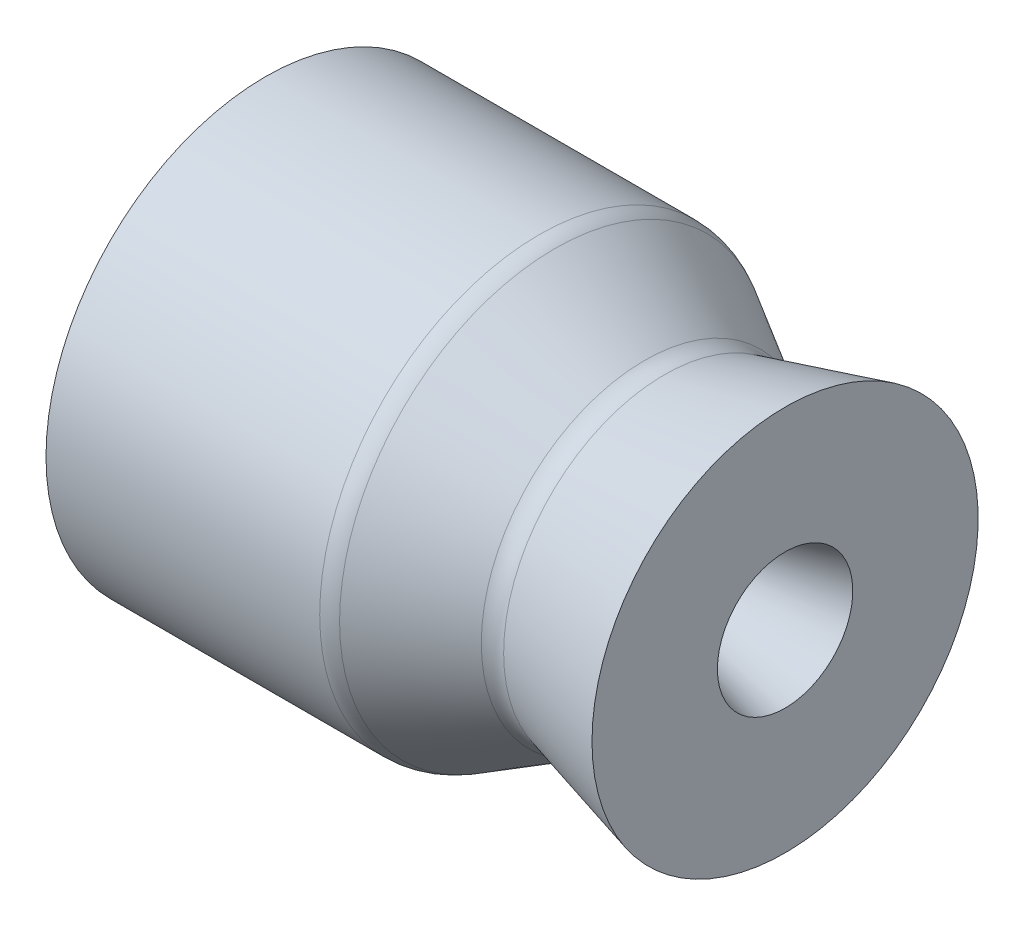
ISO-10303-21;
HEADER;
FILE_DESCRIPTION(('STEP AP214'),'2;1');
FILE_NAME('part.step','',(''),(''),'','','');
FILE_SCHEMA(('AUTOMOTIVE_DESIGN { 1 0 10303 214 1 1 1 1 }'));
ENDSEC;
DATA;
#1=APPLICATION_CONTEXT('core data for automotive mechanical design processes');
#2=APPLICATION_PROTOCOL_DEFINITION('international standard','automotive_design',2000,#1);
#3=PRODUCT_CONTEXT('',#1,'mechanical');
#4=PRODUCT('Part','Part','',(#3));
#5=PRODUCT_RELATED_PRODUCT_CATEGORY('part','',(#4));
#6=PRODUCT_DEFINITION_FORMATION('','',#4);
#7=PRODUCT_DEFINITION_CONTEXT('part definition',#1,'design');
#8=PRODUCT_DEFINITION('design','',#6,#7);
#9=PRODUCT_DEFINITION_SHAPE('','',#8);
#10=(LENGTH_UNIT() NAMED_UNIT(*) SI_UNIT(.MILLI.,.METRE.));
#11=(NAMED_UNIT(*) PLANE_ANGLE_UNIT() SI_UNIT($,.RADIAN.));
#12=(NAMED_UNIT(*) SI_UNIT($,.STERADIAN.) SOLID_ANGLE_UNIT());
#13=UNCERTAINTY_MEASURE_WITH_UNIT(LENGTH_MEASURE(1.E-05),#10,'distance_accuracy_value','');
#14=(GEOMETRIC_REPRESENTATION_CONTEXT(3) GLOBAL_UNCERTAINTY_ASSIGNED_CONTEXT((#13)) GLOBAL_UNIT_ASSIGNED_CONTEXT((#10,
#11,#12)) REPRESENTATION_CONTEXT('',''));
#15=CARTESIAN_POINT('',(0.,0.,0.));
#16=DIRECTION('',(0.,0.,1.));
#17=DIRECTION('',(1.,0.,0.));
#18=AXIS2_PLACEMENT_3D('',#15,#16,#17);
#19=CARTESIAN_POINT('',(0.,55.88,0.));
#20=DIRECTION('',(1.,0.,0.));
#21=DIRECTION('',(0.,0.,-1.));
#22=AXIS2_PLACEMENT_3D('',#19,#20,#21);
#23=PLANE('',#22);
#24=CARTESIAN_POINT('',(0.,62.6915789799551,-36.1950000000007));
#25=DIRECTION('',(-1.,0.,0.));
#26=DIRECTION('',(0.,0.,1.));
#27=AXIS2_PLACEMENT_3D('',#24,#25,#26);
#28=CIRCLE('',#27,6.985);
#29=CARTESIAN_POINT('',(0.,62.6915789799551,-29.2100000000007));
#30=VERTEX_POINT('',#29);
#31=EDGE_CURVE('E87',#30,#30,#28,.T.);
#32=ORIENTED_EDGE('',*,*,#31,.F.);
#33=EDGE_LOOP('',(#32));
#34=FACE_BOUND('',#33,.T.);
#35=CARTESIAN_POINT('',(0.,0.,72.39));
#36=DIRECTION('',(-1.,0.,0.));
#37=DIRECTION('',(0.,0.,1.));
#38=AXIS2_PLACEMENT_3D('',#35,#36,#37);
#39=CIRCLE('',#38,6.985);
#40=CARTESIAN_POINT('',(0.,0.,79.375));
#41=VERTEX_POINT('',#40);
#42=EDGE_CURVE('E98',#41,#41,#39,.T.);
#43=ORIENTED_EDGE('',*,*,#42,.F.);
#44=EDGE_LOOP('',(#43));
#45=FACE_BOUND('',#44,.T.);
#46=CARTESIAN_POINT('',(0.,-62.6915789799554,36.1950000000003));
#47=DIRECTION('',(-1.,0.,0.));
#48=DIRECTION('',(0.,0.,1.));
#49=AXIS2_PLACEMENT_3D('',#46,#47,#48);
#50=CIRCLE('',#49,6.985);
#51=CARTESIAN_POINT('',(0.,-62.6915789799554,43.1800000000003));
#52=VERTEX_POINT('',#51);
#53=EDGE_CURVE('E110',#52,#52,#50,.T.);
#54=ORIENTED_EDGE('',*,*,#53,.F.);
#55=EDGE_LOOP('',(#54));
#56=FACE_BOUND('',#55,.T.);
#57=CARTESIAN_POINT('',(0.,-62.6915789799556,-36.1949999999999));
#58=DIRECTION('',(-1.,0.,0.));
#59=DIRECTION('',(0.,0.,1.));
#60=AXIS2_PLACEMENT_3D('',#57,#58,#59);
#61=CIRCLE('',#60,6.985);
#62=CARTESIAN_POINT('',(0.,-62.6915789799556,-29.2099999999999));
#63=VERTEX_POINT('',#62);
#64=EDGE_CURVE('E122',#63,#63,#61,.T.);
#65=ORIENTED_EDGE('',*,*,#64,.F.);
#66=EDGE_LOOP('',(#65));
#67=FACE_BOUND('',#66,.T.);
#68=CARTESIAN_POINT('',(0.,0.,-72.39));
#69=DIRECTION('',(-1.,0.,0.));
#70=DIRECTION('',(0.,0.,1.));
#71=AXIS2_PLACEMENT_3D('',#68,#69,#70);
#72=CIRCLE('',#71,6.985);
#73=CARTESIAN_POINT('',(0.,0.,-65.405));
#74=VERTEX_POINT('',#73);
#75=EDGE_CURVE('E134',#74,#74,#72,.T.);
#76=ORIENTED_EDGE('',*,*,#75,.F.);
#77=EDGE_LOOP('',(#76));
#78=FACE_BOUND('',#77,.T.);
#79=CARTESIAN_POINT('',(0.,0.,0.));
#80=DIRECTION('',(-1.,0.,0.));
#81=DIRECTION('',(0.,0.,1.));
#82=AXIS2_PLACEMENT_3D('',#79,#80,#81);
#83=CIRCLE('',#82,55.88);
#84=CARTESIAN_POINT('',(0.,0.,55.88));
#85=VERTEX_POINT('',#84);
#86=EDGE_CURVE('E186',#85,#85,#83,.T.);
#87=ORIENTED_EDGE('',*,*,#86,.F.);
#88=EDGE_LOOP('',(#87));
#89=FACE_BOUND('',#88,.T.);
#90=CARTESIAN_POINT('',(0.,0.,0.));
#91=DIRECTION('',(-1.,0.,0.));
#92=DIRECTION('',(0.,0.,1.));
#93=AXIS2_PLACEMENT_3D('',#90,#91,#92);
#94=CIRCLE('',#93,88.9);
#95=CARTESIAN_POINT('',(0.,0.,88.9));
#96=VERTEX_POINT('',#95);
#97=EDGE_CURVE('E182',#96,#96,#94,.T.);
#98=ORIENTED_EDGE('',*,*,#97,.T.);
#99=EDGE_LOOP('',(#98));
#100=FACE_BOUND('',#99,.T.);
#101=CARTESIAN_POINT('',(0.,62.6915789799558,36.1949999999994));
#102=DIRECTION('',(-1.,0.,0.));
#103=DIRECTION('',(0.,0.,1.));
#104=AXIS2_PLACEMENT_3D('',#101,#102,#103);
#105=CIRCLE('',#104,6.985);
#106=CARTESIAN_POINT('',(0.,62.6915789799558,43.1799999999994));
#107=VERTEX_POINT('',#106);
#108=EDGE_CURVE('E78',#107,#107,#105,.T.);
#109=ORIENTED_EDGE('',*,*,#108,.F.);
#110=EDGE_LOOP('',(#109));
#111=FACE_BOUND('',#110,.T.);
#112=ADVANCED_FACE('F39',(#34,#45,#56,#67,#78,#89,#100,#111),#23,.F.);
#113=CARTESIAN_POINT('',(110.897045256125,0.,0.));
#114=DIRECTION('',(-1.,0.,0.));
#115=DIRECTION('',(0.,0.,1.));
#116=AXIS2_PLACEMENT_3D('',#113,#114,#115);
#117=TOROIDAL_SURFACE('',#116,25.4,12.7);
#118=CARTESIAN_POINT('',(117.247045256125,0.,0.));
#119=DIRECTION('',(-1.,0.,0.));
#120=DIRECTION('',(0.,0.,1.));
#121=AXIS2_PLACEMENT_3D('',#118,#119,#120);
#122=CIRCLE('',#121,36.3985226280624);
#123=CARTESIAN_POINT('',(117.247045256125,0.,36.3985226280624));
#124=VERTEX_POINT('',#123);
#125=EDGE_CURVE('E146',#124,#124,#122,.T.);
#126=ORIENTED_EDGE('',*,*,#125,.F.);
#127=EDGE_LOOP('',(#126));
#128=FACE_BOUND('',#127,.T.);
#129=CARTESIAN_POINT('',(110.897045256125,0.,0.));
#130=DIRECTION('',(-1.,0.,0.));
#131=DIRECTION('',(0.,0.,1.));
#132=AXIS2_PLACEMENT_3D('',#129,#130,#131);
#133=CIRCLE('',#132,38.1);
#134=CARTESIAN_POINT('',(110.897045256125,0.,38.1));
#135=VERTEX_POINT('',#134);
#136=EDGE_CURVE('E11',#135,#135,#133,.T.);
#137=ORIENTED_EDGE('',*,*,#136,.T.);
#138=EDGE_LOOP('',(#137));
#139=FACE_BOUND('',#138,.T.);
#140=ADVANCED_FACE('F41',(#128,#139),#117,.F.);
#141=CARTESIAN_POINT('',(0.,0.,0.));
#142=DIRECTION('',(-1.,0.,0.));
#143=DIRECTION('',(0.,0.,1.));
#144=AXIS2_PLACEMENT_3D('',#141,#142,#143);
#145=CYLINDRICAL_SURFACE('',#144,38.1);
#146=ORIENTED_EDGE('',*,*,#136,.F.);
#147=EDGE_LOOP('',(#146));
#148=FACE_BOUND('',#147,.T.);
#149=CARTESIAN_POINT('',(0.,0.,0.));
#150=DIRECTION('',(-1.,0.,0.));
#151=DIRECTION('',(0.,0.,1.));
#152=AXIS2_PLACEMENT_3D('',#149,#150,#151);
#153=CIRCLE('',#152,38.1);
#154=CARTESIAN_POINT('',(0.,0.,38.1));
#155=VERTEX_POINT('',#154);
#156=EDGE_CURVE('E48',#155,#155,#153,.T.);
#157=ORIENTED_EDGE('',*,*,#156,.T.);
#158=EDGE_LOOP('',(#157));
#159=FACE_BOUND('',#158,.T.);
#160=ADVANCED_FACE('F205',(#148,#159),#145,.F.);
#161=CARTESIAN_POINT('',(0.,38.1,0.));
#162=DIRECTION('',(1.,0.,0.));
#163=DIRECTION('',(0.,0.,-1.));
#164=AXIS2_PLACEMENT_3D('',#161,#162,#163);
#165=PLANE('',#164);
#166=ORIENTED_EDGE('',*,*,#156,.F.);
#167=EDGE_LOOP('',(#166));
#168=FACE_BOUND('',#167,.T.);
#169=CARTESIAN_POINT('',(0.,0.,0.));
#170=DIRECTION('',(-1.,0.,0.));
#171=DIRECTION('',(0.,0.,1.));
#172=AXIS2_PLACEMENT_3D('',#169,#170,#171);
#173=CIRCLE('',#172,45.72);
#174=CARTESIAN_POINT('',(0.,0.,45.72));
#175=VERTEX_POINT('',#174);
#176=EDGE_CURVE('E198',#175,#175,#173,.T.);
#177=ORIENTED_EDGE('',*,*,#176,.T.);
#178=EDGE_LOOP('',(#177));
#179=FACE_BOUND('',#178,.T.);
#180=ADVANCED_FACE('F207',(#168,#179),#165,.F.);
#181=CARTESIAN_POINT('',(0.,0.,0.));
#182=DIRECTION('',(-1.,0.,0.));
#183=DIRECTION('',(0.,0.,1.));
#184=AXIS2_PLACEMENT_3D('',#181,#182,#183);
#185=CYLINDRICAL_SURFACE('',#184,45.72);
#186=ORIENTED_EDGE('',*,*,#176,.F.);
#187=EDGE_LOOP('',(#186));
#188=FACE_BOUND('',#187,.T.);
#189=CARTESIAN_POINT('',(5.08,0.,0.));
#190=DIRECTION('',(-1.,0.,0.));
#191=DIRECTION('',(0.,0.,1.));
#192=AXIS2_PLACEMENT_3D('',#189,#190,#191);
#193=CIRCLE('',#192,45.72);
#194=CARTESIAN_POINT('',(5.08,0.,45.72));
#195=VERTEX_POINT('',#194);
#196=EDGE_CURVE('E194',#195,#195,#193,.T.);
#197=ORIENTED_EDGE('',*,*,#196,.T.);
#198=EDGE_LOOP('',(#197));
#199=FACE_BOUND('',#198,.T.);
#200=ADVANCED_FACE('F210',(#188,#199),#185,.T.);
#201=CARTESIAN_POINT('',(5.08,45.72,0.));
#202=DIRECTION('',(1.,0.,0.));
#203=DIRECTION('',(0.,0.,-1.));
#204=AXIS2_PLACEMENT_3D('',#201,#202,#203);
#205=PLANE('',#204);
#206=ORIENTED_EDGE('',*,*,#196,.F.);
#207=EDGE_LOOP('',(#206));
#208=FACE_BOUND('',#207,.T.);
#209=CARTESIAN_POINT('',(5.08,0.,0.));
#210=DIRECTION('',(-1.,0.,0.));
#211=DIRECTION('',(0.,0.,1.));
#212=AXIS2_PLACEMENT_3D('',#209,#210,#211);
#213=CIRCLE('',#212,55.88);
#214=CARTESIAN_POINT('',(5.08,0.,55.88));
#215=VERTEX_POINT('',#214);
#216=EDGE_CURVE('E190',#215,#215,#213,.T.);
#217=ORIENTED_EDGE('',*,*,#216,.T.);
#218=EDGE_LOOP('',(#217));
#219=FACE_BOUND('',#218,.T.);
#220=ADVANCED_FACE('F216',(#208,#219),#205,.F.);
#221=CARTESIAN_POINT('',(0.,0.,0.));
#222=DIRECTION('',(-1.,0.,0.));
#223=DIRECTION('',(0.,0.,1.));
#224=AXIS2_PLACEMENT_3D('',#221,#222,#223);
#225=CYLINDRICAL_SURFACE('',#224,55.88);
#226=ORIENTED_EDGE('',*,*,#216,.F.);
#227=EDGE_LOOP('',(#226));
#228=FACE_BOUND('',#227,.T.);
#229=ORIENTED_EDGE('',*,*,#86,.T.);
#230=EDGE_LOOP('',(#229));
#231=FACE_BOUND('',#230,.T.);
#232=ADVANCED_FACE('F222',(#228,#231),#225,.F.);
#233=CARTESIAN_POINT('',(0.,0.,0.));
#234=DIRECTION('',(-1.,0.,0.));
#235=DIRECTION('',(0.,0.,1.));
#236=AXIS2_PLACEMENT_3D('',#233,#234,#235);
#237=CYLINDRICAL_SURFACE('',#236,88.9);
#238=ORIENTED_EDGE('',*,*,#97,.F.);
#239=EDGE_LOOP('',(#238));
#240=FACE_BOUND('',#239,.T.);
#241=CARTESIAN_POINT('',(110.897045256125,0.,0.));
#242=DIRECTION('',(-1.,0.,0.));
#243=DIRECTION('',(0.,0.,1.));
#244=AXIS2_PLACEMENT_3D('',#241,#242,#243);
#245=CIRCLE('',#244,88.9);
#246=CARTESIAN_POINT('',(110.897045256125,0.,88.9));
#247=VERTEX_POINT('',#246);
#248=EDGE_CURVE('E178',#247,#247,#245,.T.);
#249=ORIENTED_EDGE('',*,*,#248,.T.);
#250=EDGE_LOOP('',(#249));
#251=FACE_BOUND('',#250,.T.);
#252=ADVANCED_FACE('F228',(#240,#251),#237,.T.);
#253=CARTESIAN_POINT('',(110.897045256125,0.,0.));
#254=DIRECTION('',(-1.,0.,0.));
#255=DIRECTION('',(0.,0.,1.));
#256=AXIS2_PLACEMENT_3D('',#253,#254,#255);
#257=TOROIDAL_SURFACE('',#256,76.2,12.7);
#258=ORIENTED_EDGE('',*,*,#248,.F.);
#259=EDGE_LOOP('',(#258));
#260=FACE_BOUND('',#259,.T.);
#261=CARTESIAN_POINT('',(117.247045256125,0.,0.));
#262=DIRECTION('',(-1.,0.,0.));
#263=DIRECTION('',(0.,0.,1.));
#264=AXIS2_PLACEMENT_3D('',#261,#262,#263);
#265=CIRCLE('',#264,87.1985226280624);
#266=CARTESIAN_POINT('',(117.247045256125,0.,87.1985226280624));
#267=VERTEX_POINT('',#266);
#268=EDGE_CURVE('E174',#267,#267,#265,.T.);
#269=ORIENTED_EDGE('',*,*,#268,.T.);
#270=EDGE_LOOP('',(#269));
#271=FACE_BOUND('',#270,.T.);
#272=ADVANCED_FACE('F329',(#260,#271),#257,.T.);
#273=CARTESIAN_POINT('',(153.648338424054,0.,0.));
#274=DIRECTION('',(-1.,0.,0.));
#275=DIRECTION('',(0.,0.,1.));
#276=AXIS2_PLACEMENT_3D('',#273,#274,#275);
#277=CONICAL_SURFACE('',#276,66.1822262187082,0.523598775598291);
#278=ORIENTED_EDGE('',*,*,#268,.F.);
#279=EDGE_LOOP('',(#278));
#280=FACE_BOUND('',#279,.T.);
#281=CARTESIAN_POINT('',(153.648338424054,0.,0.));
#282=DIRECTION('',(-1.,0.,0.));
#283=DIRECTION('',(0.,0.,1.));
#284=AXIS2_PLACEMENT_3D('',#281,#282,#283);
#285=CIRCLE('',#284,66.1822262187082);
#286=CARTESIAN_POINT('',(153.648338424054,0.,66.1822262187082));
#287=VERTEX_POINT('',#286);
#288=EDGE_CURVE('E170',#287,#287,#285,.T.);
#289=ORIENTED_EDGE('',*,*,#288,.T.);
#290=EDGE_LOOP('',(#289));
#291=FACE_BOUND('',#290,.T.);
#292=ADVANCED_FACE('F325',(#280,#291),#277,.T.);
#293=CARTESIAN_POINT('',(158.918838424054,0.,0.));
#294=DIRECTION('',(-1.,0.,0.));
#295=DIRECTION('',(0.,0.,1.));
#296=AXIS2_PLACEMENT_3D('',#293,#294,#295);
#297=TOROIDAL_SURFACE('',#296,75.311,10.541);
#298=ORIENTED_EDGE('',*,*,#288,.F.);
#299=EDGE_LOOP('',(#298));
#300=FACE_BOUND('',#299,.T.);
#301=CARTESIAN_POINT('',(161.64704997848,0.,0.));
#302=DIRECTION('',(-1.,0.,0.));
#303=DIRECTION('',(0.,0.,1.));
#304=AXIS2_PLACEMENT_3D('',#301,#302,#303);
#305=CIRCLE('',#304,65.1291758650869);
#306=CARTESIAN_POINT('',(161.64704997848,0.,65.1291758650869));
#307=VERTEX_POINT('',#306);
#308=EDGE_CURVE('E166',#307,#307,#305,.T.);
#309=ORIENTED_EDGE('',*,*,#308,.T.);
#310=EDGE_LOOP('',(#309));
#311=FACE_BOUND('',#310,.T.);
#312=ADVANCED_FACE('F321',(#300,#311),#297,.F.);
#313=CARTESIAN_POINT('',(210.545228126124,0.,0.));
#314=DIRECTION('',(1.,0.,0.));
#315=DIRECTION('',(0.,0.,-1.));
#316=AXIS2_PLACEMENT_3D('',#313,#314,#315);
#317=CONICAL_SURFACE('',#316,78.231403211101,0.261799387799143);
#318=ORIENTED_EDGE('',*,*,#308,.F.);
#319=EDGE_LOOP('',(#318));
#320=FACE_BOUND('',#319,.T.);
#321=CARTESIAN_POINT('',(210.545228126124,0.,0.));
#322=DIRECTION('',(-1.,0.,0.));
#323=DIRECTION('',(0.,0.,1.));
#324=AXIS2_PLACEMENT_3D('',#321,#322,#323);
#325=CIRCLE('',#324,78.231403211101);
#326=CARTESIAN_POINT('',(210.545228126124,0.,78.231403211101));
#327=VERTEX_POINT('',#326);
#328=EDGE_CURVE('E162',#327,#327,#325,.T.);
#329=ORIENTED_EDGE('',*,*,#328,.T.);
#330=EDGE_LOOP('',(#329));
#331=FACE_BOUND('',#330,.T.);
#332=ADVANCED_FACE('F317',(#320,#331),#317,.T.);
#333=CARTESIAN_POINT('',(210.545228126124,78.231403211101,0.));
#334=DIRECTION('',(-1.,0.,0.));
#335=DIRECTION('',(0.,0.,1.));
#336=AXIS2_PLACEMENT_3D('',#333,#334,#335);
#337=PLANE('',#336);
#338=ORIENTED_EDGE('',*,*,#328,.F.);
#339=EDGE_LOOP('',(#338));
#340=FACE_BOUND('',#339,.T.);
#341=CARTESIAN_POINT('',(210.545228126124,0.,0.));
#342=DIRECTION('',(-1.,0.,0.));
#343=DIRECTION('',(0.,0.,1.));
#344=AXIS2_PLACEMENT_3D('',#341,#342,#343);
#345=CIRCLE('',#344,27.431403211101);
#346=CARTESIAN_POINT('',(210.545228126124,0.,27.431403211101));
#347=VERTEX_POINT('',#346);
#348=EDGE_CURVE('E158',#347,#347,#345,.T.);
#349=ORIENTED_EDGE('',*,*,#348,.T.);
#350=EDGE_LOOP('',(#349));
#351=FACE_BOUND('',#350,.T.);
#352=ADVANCED_FACE('F313',(#340,#351),#337,.F.);
#353=CARTESIAN_POINT('',(161.64704997848,0.,0.));
#354=DIRECTION('',(1.,0.,0.));
#355=DIRECTION('',(0.,0.,-1.));
#356=AXIS2_PLACEMENT_3D('',#353,#354,#355);
#357=CONICAL_SURFACE('',#356,14.3291758650869,0.261799387799143);
#358=ORIENTED_EDGE('',*,*,#348,.F.);
#359=EDGE_LOOP('',(#358));
#360=FACE_BOUND('',#359,.T.);
#361=CARTESIAN_POINT('',(161.64704997848,0.,0.));
#362=DIRECTION('',(-1.,0.,0.));
#363=DIRECTION('',(0.,0.,1.));
#364=AXIS2_PLACEMENT_3D('',#361,#362,#363);
#365=CIRCLE('',#364,14.3291758650869);
#366=CARTESIAN_POINT('',(161.64704997848,0.,14.3291758650869));
#367=VERTEX_POINT('',#366);
#368=EDGE_CURVE('E154',#367,#367,#365,.T.);
#369=ORIENTED_EDGE('',*,*,#368,.T.);
#370=EDGE_LOOP('',(#369));
#371=FACE_BOUND('',#370,.T.);
#372=ADVANCED_FACE('F309',(#360,#371),#357,.F.);
#373=CARTESIAN_POINT('',(158.918838424054,0.,0.));
#374=DIRECTION('',(-1.,0.,0.));
#375=DIRECTION('',(0.,0.,1.));
#376=AXIS2_PLACEMENT_3D('',#373,#374,#375);
#377=TOROIDAL_SURFACE('',#376,24.511,10.541);
#378=ORIENTED_EDGE('',*,*,#368,.F.);
#379=EDGE_LOOP('',(#378));
#380=FACE_BOUND('',#379,.T.);
#381=CARTESIAN_POINT('',(153.648338424054,0.,0.));
#382=DIRECTION('',(-1.,0.,0.));
#383=DIRECTION('',(0.,0.,1.));
#384=AXIS2_PLACEMENT_3D('',#381,#382,#383);
#385=CIRCLE('',#384,15.3822262187082);
#386=CARTESIAN_POINT('',(153.648338424054,0.,15.3822262187082));
#387=VERTEX_POINT('',#386);
#388=EDGE_CURVE('E150',#387,#387,#385,.T.);
#389=ORIENTED_EDGE('',*,*,#388,.T.);
#390=EDGE_LOOP('',(#389));
#391=FACE_BOUND('',#390,.T.);
#392=ADVANCED_FACE('F305',(#380,#391),#377,.T.);
#393=CARTESIAN_POINT('',(117.247045256125,0.,0.));
#394=DIRECTION('',(-1.,0.,0.));
#395=DIRECTION('',(0.,0.,1.));
#396=AXIS2_PLACEMENT_3D('',#393,#394,#395);
#397=CONICAL_SURFACE('',#396,36.3985226280624,0.523598775598291);
#398=ORIENTED_EDGE('',*,*,#388,.F.);
#399=EDGE_LOOP('',(#398));
#400=FACE_BOUND('',#399,.T.);
#401=ORIENTED_EDGE('',*,*,#125,.T.);
#402=EDGE_LOOP('',(#401));
#403=FACE_BOUND('',#402,.T.);
#404=ADVANCED_FACE('F302',(#400,#403),#397,.F.);
#405=CARTESIAN_POINT('',(12.7,0.,-72.39));
#406=DIRECTION('',(-1.,0.,0.));
#407=DIRECTION('',(0.,0.,1.));
#408=AXIS2_PLACEMENT_3D('',#405,#406,#407);
#409=CONICAL_SURFACE('',#408,6.35,1.02974425867665);
#410=CARTESIAN_POINT('',(16.515464930825,0.,-72.39));
#411=VERTEX_POINT('',#410);
#412=VERTEX_LOOP('',#411);
#413=FACE_BOUND('',#412,.T.);
#414=CARTESIAN_POINT('',(12.7,0.,-72.39));
#415=DIRECTION('',(-1.,0.,0.));
#416=DIRECTION('',(0.,0.,1.));
#417=AXIS2_PLACEMENT_3D('',#414,#415,#416);
#418=CIRCLE('',#417,6.35);
#419=CARTESIAN_POINT('',(12.7,0.,-66.04));
#420=VERTEX_POINT('',#419);
#421=EDGE_CURVE('E142',#420,#420,#418,.T.);
#422=ORIENTED_EDGE('',*,*,#421,.T.);
#423=EDGE_LOOP('',(#422));
#424=FACE_BOUND('',#423,.T.);
#425=ADVANCED_FACE('F298',(#413,#424),#409,.F.);
#426=CARTESIAN_POINT('',(0.,0.,-72.39));
#427=DIRECTION('',(-1.,0.,0.));
#428=DIRECTION('',(0.,0.,1.));
#429=AXIS2_PLACEMENT_3D('',#426,#427,#428);
#430=CYLINDRICAL_SURFACE('',#429,6.35);
#431=ORIENTED_EDGE('',*,*,#421,.F.);
#432=EDGE_LOOP('',(#431));
#433=FACE_BOUND('',#432,.T.);
#434=CARTESIAN_POINT('',(0.635000000000002,0.,-72.39));
#435=DIRECTION('',(-1.,0.,0.));
#436=DIRECTION('',(0.,0.,1.));
#437=AXIS2_PLACEMENT_3D('',#434,#435,#436);
#438=CIRCLE('',#437,6.35);
#439=CARTESIAN_POINT('',(0.635000000000002,0.,-66.04));
#440=VERTEX_POINT('',#439);
#441=EDGE_CURVE('E138',#440,#440,#438,.T.);
#442=ORIENTED_EDGE('',*,*,#441,.T.);
#443=EDGE_LOOP('',(#442));
#444=FACE_BOUND('',#443,.T.);
#445=ADVANCED_FACE('F294',(#433,#444),#430,.F.);
#446=CARTESIAN_POINT('',(0.,0.,-72.39));
#447=DIRECTION('',(-1.,0.,0.));
#448=DIRECTION('',(0.,0.,1.));
#449=AXIS2_PLACEMENT_3D('',#446,#447,#448);
#450=CONICAL_SURFACE('',#449,6.985,0.785398163397446);
#451=ORIENTED_EDGE('',*,*,#441,.F.);
#452=EDGE_LOOP('',(#451));
#453=FACE_BOUND('',#452,.T.);
#454=ORIENTED_EDGE('',*,*,#75,.T.);
#455=EDGE_LOOP('',(#454));
#456=FACE_BOUND('',#455,.T.);
#457=ADVANCED_FACE('F291',(#453,#456),#450,.F.);
#458=CARTESIAN_POINT('',(12.7,-62.6915789799556,-36.1949999999999));
#459=DIRECTION('',(-1.,0.,0.));
#460=DIRECTION('',(0.,0.,1.));
#461=AXIS2_PLACEMENT_3D('',#458,#459,#460);
#462=CONICAL_SURFACE('',#461,6.34999999999999,1.02974425867665);
#463=CARTESIAN_POINT('',(16.515464930825,-62.6915789799556,-36.1949999999999));
#464=VERTEX_POINT('',#463);
#465=VERTEX_LOOP('',#464);
#466=FACE_BOUND('',#465,.T.);
#467=CARTESIAN_POINT('',(12.7,-62.6915789799556,-36.1949999999999));
#468=DIRECTION('',(-1.,0.,0.));
#469=DIRECTION('',(0.,0.,1.));
#470=AXIS2_PLACEMENT_3D('',#467,#468,#469);
#471=CIRCLE('',#470,6.34999999999999);
#472=CARTESIAN_POINT('',(12.7,-62.6915789799556,-29.8449999999999));
#473=VERTEX_POINT('',#472);
#474=EDGE_CURVE('E130',#473,#473,#471,.T.);
#475=ORIENTED_EDGE('',*,*,#474,.T.);
#476=EDGE_LOOP('',(#475));
#477=FACE_BOUND('',#476,.T.);
#478=ADVANCED_FACE('F287',(#466,#477),#462,.F.);
#479=CARTESIAN_POINT('',(0.,-62.6915789799556,-36.1949999999999));
#480=DIRECTION('',(-1.,0.,0.));
#481=DIRECTION('',(0.,0.,1.));
#482=AXIS2_PLACEMENT_3D('',#479,#480,#481);
#483=CYLINDRICAL_SURFACE('',#482,6.35);
#484=ORIENTED_EDGE('',*,*,#474,.F.);
#485=EDGE_LOOP('',(#484));
#486=FACE_BOUND('',#485,.T.);
#487=CARTESIAN_POINT('',(0.635000000000002,-62.6915789799556,-36.1949999999999));
#488=DIRECTION('',(-1.,0.,0.));
#489=DIRECTION('',(0.,0.,1.));
#490=AXIS2_PLACEMENT_3D('',#487,#488,#489);
#491=CIRCLE('',#490,6.35);
#492=CARTESIAN_POINT('',(0.635000000000002,-62.6915789799556,-29.8449999999999));
#493=VERTEX_POINT('',#492);
#494=EDGE_CURVE('E126',#493,#493,#491,.T.);
#495=ORIENTED_EDGE('',*,*,#494,.T.);
#496=EDGE_LOOP('',(#495));
#497=FACE_BOUND('',#496,.T.);
#498=ADVANCED_FACE('F283',(#486,#497),#483,.F.);
#499=CARTESIAN_POINT('',(0.,-62.6915789799556,-36.1949999999999));
#500=DIRECTION('',(-1.,0.,0.));
#501=DIRECTION('',(0.,0.,1.));
#502=AXIS2_PLACEMENT_3D('',#499,#500,#501);
#503=CONICAL_SURFACE('',#502,6.985,0.785398163397444);
#504=ORIENTED_EDGE('',*,*,#494,.F.);
#505=EDGE_LOOP('',(#504));
#506=FACE_BOUND('',#505,.T.);
#507=ORIENTED_EDGE('',*,*,#64,.T.);
#508=EDGE_LOOP('',(#507));
#509=FACE_BOUND('',#508,.T.);
#510=ADVANCED_FACE('F279',(#506,#509),#503,.F.);
#511=CARTESIAN_POINT('',(12.7,-62.6915789799554,36.1950000000003));
#512=DIRECTION('',(-1.,0.,0.));
#513=DIRECTION('',(0.,0.,1.));
#514=AXIS2_PLACEMENT_3D('',#511,#512,#513);
#515=CONICAL_SURFACE('',#514,6.34999999999999,1.02974425867665);
#516=CARTESIAN_POINT('',(16.515464930825,-62.6915789799554,36.1950000000003));
#517=VERTEX_POINT('',#516);
#518=VERTEX_LOOP('',#517);
#519=FACE_BOUND('',#518,.T.);
#520=CARTESIAN_POINT('',(12.7,-62.6915789799554,36.1950000000003));
#521=DIRECTION('',(-1.,0.,0.));
#522=DIRECTION('',(0.,0.,1.));
#523=AXIS2_PLACEMENT_3D('',#520,#521,#522);
#524=CIRCLE('',#523,6.34999999999999);
#525=CARTESIAN_POINT('',(12.7,-62.6915789799554,42.5450000000003));
#526=VERTEX_POINT('',#525);
#527=EDGE_CURVE('E118',#526,#526,#524,.T.);
#528=ORIENTED_EDGE('',*,*,#527,.T.);
#529=EDGE_LOOP('',(#528));
#530=FACE_BOUND('',#529,.T.);
#531=ADVANCED_FACE('F275',(#519,#530),#515,.F.);
#532=CARTESIAN_POINT('',(0.,-62.6915789799554,36.1950000000003));
#533=DIRECTION('',(-1.,0.,0.));
#534=DIRECTION('',(0.,0.,1.));
#535=AXIS2_PLACEMENT_3D('',#532,#533,#534);
#536=CYLINDRICAL_SURFACE('',#535,6.35);
#537=ORIENTED_EDGE('',*,*,#527,.F.);
#538=EDGE_LOOP('',(#537));
#539=FACE_BOUND('',#538,.T.);
#540=CARTESIAN_POINT('',(0.635000000000002,-62.6915789799554,36.1950000000003));
#541=DIRECTION('',(-1.,0.,0.));
#542=DIRECTION('',(0.,0.,1.));
#543=AXIS2_PLACEMENT_3D('',#540,#541,#542);
#544=CIRCLE('',#543,6.35);
#545=CARTESIAN_POINT('',(0.635000000000002,-62.6915789799554,42.5450000000003));
#546=VERTEX_POINT('',#545);
#547=EDGE_CURVE('E114',#546,#546,#544,.T.);
#548=ORIENTED_EDGE('',*,*,#547,.T.);
#549=EDGE_LOOP('',(#548));
#550=FACE_BOUND('',#549,.T.);
#551=ADVANCED_FACE('F271',(#539,#550),#536,.F.);
#552=CARTESIAN_POINT('',(0.,-62.6915789799554,36.1950000000003));
#553=DIRECTION('',(-1.,0.,0.));
#554=DIRECTION('',(0.,0.,1.));
#555=AXIS2_PLACEMENT_3D('',#552,#553,#554);
#556=CONICAL_SURFACE('',#555,6.985,0.785398163397444);
#557=ORIENTED_EDGE('',*,*,#547,.F.);
#558=EDGE_LOOP('',(#557));
#559=FACE_BOUND('',#558,.T.);
#560=ORIENTED_EDGE('',*,*,#53,.T.);
#561=EDGE_LOOP('',(#560));
#562=FACE_BOUND('',#561,.T.);
#563=ADVANCED_FACE('F267',(#559,#562),#556,.F.);
#564=CARTESIAN_POINT('',(12.7,0.,72.39));
#565=DIRECTION('',(-1.,0.,0.));
#566=DIRECTION('',(0.,0.,1.));
#567=AXIS2_PLACEMENT_3D('',#564,#565,#566);
#568=CONICAL_SURFACE('',#567,6.35,1.02974425867665);
#569=CARTESIAN_POINT('',(16.515464930825,0.,72.39));
#570=VERTEX_POINT('',#569);
#571=VERTEX_LOOP('',#570);
#572=FACE_BOUND('',#571,.T.);
#573=CARTESIAN_POINT('',(12.7,0.,72.39));
#574=DIRECTION('',(-1.,0.,0.));
#575=DIRECTION('',(0.,0.,1.));
#576=AXIS2_PLACEMENT_3D('',#573,#574,#575);
#577=CIRCLE('',#576,6.35);
#578=CARTESIAN_POINT('',(12.7,0.,78.74));
#579=VERTEX_POINT('',#578);
#580=EDGE_CURVE('E106',#579,#579,#577,.T.);
#581=ORIENTED_EDGE('',*,*,#580,.T.);
#582=EDGE_LOOP('',(#581));
#583=FACE_BOUND('',#582,.T.);
#584=ADVANCED_FACE('F263',(#572,#583),#568,.F.);
#585=CARTESIAN_POINT('',(0.,0.,72.39));
#586=DIRECTION('',(-1.,0.,0.));
#587=DIRECTION('',(0.,0.,1.));
#588=AXIS2_PLACEMENT_3D('',#585,#586,#587);
#589=CYLINDRICAL_SURFACE('',#588,6.35);
#590=ORIENTED_EDGE('',*,*,#580,.F.);
#591=EDGE_LOOP('',(#590));
#592=FACE_BOUND('',#591,.T.);
#593=CARTESIAN_POINT('',(0.635000000000002,0.,72.39));
#594=DIRECTION('',(-1.,0.,0.));
#595=DIRECTION('',(0.,0.,1.));
#596=AXIS2_PLACEMENT_3D('',#593,#594,#595);
#597=CIRCLE('',#596,6.35);
#598=CARTESIAN_POINT('',(0.635000000000002,0.,78.74));
#599=VERTEX_POINT('',#598);
#600=EDGE_CURVE('E102',#599,#599,#597,.T.);
#601=ORIENTED_EDGE('',*,*,#600,.T.);
#602=EDGE_LOOP('',(#601));
#603=FACE_BOUND('',#602,.T.);
#604=ADVANCED_FACE('F259',(#592,#603),#589,.F.);
#605=CARTESIAN_POINT('',(0.,0.,72.39));
#606=DIRECTION('',(-1.,0.,0.));
#607=DIRECTION('',(0.,0.,1.));
#608=AXIS2_PLACEMENT_3D('',#605,#606,#607);
#609=CONICAL_SURFACE('',#608,6.985,0.785398163397446);
#610=ORIENTED_EDGE('',*,*,#600,.F.);
#611=EDGE_LOOP('',(#610));
#612=FACE_BOUND('',#611,.T.);
#613=ORIENTED_EDGE('',*,*,#42,.T.);
#614=EDGE_LOOP('',(#613));
#615=FACE_BOUND('',#614,.T.);
#616=ADVANCED_FACE('F255',(#612,#615),#609,.F.);
#617=CARTESIAN_POINT('',(12.7,62.6915789799558,36.1949999999994));
#618=DIRECTION('',(-1.,0.,0.));
#619=DIRECTION('',(0.,0.,1.));
#620=AXIS2_PLACEMENT_3D('',#617,#618,#619);
#621=CONICAL_SURFACE('',#620,6.34999999999999,1.02974425867665);
#622=CARTESIAN_POINT('',(16.515464930825,62.6915789799558,36.1949999999994));
#623=VERTEX_POINT('',#622);
#624=VERTEX_LOOP('',#623);
#625=FACE_BOUND('',#624,.T.);
#626=CARTESIAN_POINT('',(12.7,62.6915789799558,36.1949999999994));
#627=DIRECTION('',(-1.,0.,0.));
#628=DIRECTION('',(0.,0.,1.));
#629=AXIS2_PLACEMENT_3D('',#626,#627,#628);
#630=CIRCLE('',#629,6.34999999999999);
#631=CARTESIAN_POINT('',(12.7,62.6915789799558,42.5449999999994));
#632=VERTEX_POINT('',#631);
#633=EDGE_CURVE('E94',#632,#632,#630,.T.);
#634=ORIENTED_EDGE('',*,*,#633,.T.);
#635=EDGE_LOOP('',(#634));
#636=FACE_BOUND('',#635,.T.);
#637=ADVANCED_FACE('F247',(#625,#636),#621,.F.);
#638=CARTESIAN_POINT('',(0.,62.6915789799558,36.1949999999994));
#639=DIRECTION('',(-1.,0.,0.));
#640=DIRECTION('',(0.,0.,1.));
#641=AXIS2_PLACEMENT_3D('',#638,#639,#640);
#642=CYLINDRICAL_SURFACE('',#641,6.34999999999999);
#643=ORIENTED_EDGE('',*,*,#633,.F.);
#644=EDGE_LOOP('',(#643));
#645=FACE_BOUND('',#644,.T.);
#646=CARTESIAN_POINT('',(0.635000000000002,62.6915789799558,36.1949999999994));
#647=DIRECTION('',(-1.,0.,0.));
#648=DIRECTION('',(0.,0.,1.));
#649=AXIS2_PLACEMENT_3D('',#646,#647,#648);
#650=CIRCLE('',#649,6.34999999999999);
#651=CARTESIAN_POINT('',(0.635000000000002,62.6915789799558,42.5449999999994));
#652=VERTEX_POINT('',#651);
#653=EDGE_CURVE('E84',#652,#652,#650,.T.);
#654=ORIENTED_EDGE('',*,*,#653,.T.);
#655=EDGE_LOOP('',(#654));
#656=FACE_BOUND('',#655,.T.);
#657=ADVANCED_FACE('F241',(#645,#656),#642,.F.);
#658=CARTESIAN_POINT('',(0.,62.6915789799558,36.1949999999994));
#659=DIRECTION('',(-1.,0.,0.));
#660=DIRECTION('',(0.,0.,1.));
#661=AXIS2_PLACEMENT_3D('',#658,#659,#660);
#662=CONICAL_SURFACE('',#661,6.985,0.785398163397454);
#663=ORIENTED_EDGE('',*,*,#653,.F.);
#664=EDGE_LOOP('',(#663));
#665=FACE_BOUND('',#664,.T.);
#666=ORIENTED_EDGE('',*,*,#108,.T.);
#667=EDGE_LOOP('',(#666));
#668=FACE_BOUND('',#667,.T.);
#669=ADVANCED_FACE('F71',(#665,#668),#662,.F.);
#670=CARTESIAN_POINT('',(12.7,62.6915789799551,-36.1950000000007));
#671=DIRECTION('',(-1.,0.,0.));
#672=DIRECTION('',(0.,0.,1.));
#673=AXIS2_PLACEMENT_3D('',#670,#671,#672);
#674=CONICAL_SURFACE('',#673,6.34999999999999,1.02974425867665);
#675=CARTESIAN_POINT('',(16.515464930825,62.6915789799551,-36.1950000000007));
#676=VERTEX_POINT('',#675);
#677=VERTEX_LOOP('',#676);
#678=FACE_BOUND('',#677,.T.);
#679=CARTESIAN_POINT('',(12.7,62.6915789799551,-36.1950000000007));
#680=DIRECTION('',(-1.,0.,0.));
#681=DIRECTION('',(0.,0.,1.));
#682=AXIS2_PLACEMENT_3D('',#679,#680,#681);
#683=CIRCLE('',#682,6.34999999999999);
#684=CARTESIAN_POINT('',(12.7,62.6915789799551,-29.8450000000007));
#685=VERTEX_POINT('',#684);
#686=EDGE_CURVE('E75',#685,#685,#683,.T.);
#687=ORIENTED_EDGE('',*,*,#686,.T.);
#688=EDGE_LOOP('',(#687));
#689=FACE_BOUND('',#688,.T.);
#690=ADVANCED_FACE('F67',(#678,#689),#674,.F.);
#691=CARTESIAN_POINT('',(0.,62.6915789799551,-36.1950000000007));
#692=DIRECTION('',(-1.,0.,0.));
#693=DIRECTION('',(0.,0.,1.));
#694=AXIS2_PLACEMENT_3D('',#691,#692,#693);
#695=CYLINDRICAL_SURFACE('',#694,6.34999999999999);
#696=ORIENTED_EDGE('',*,*,#686,.F.);
#697=EDGE_LOOP('',(#696));
#698=FACE_BOUND('',#697,.T.);
#699=CARTESIAN_POINT('',(0.635000000000002,62.6915789799551,-36.1950000000007));
#700=DIRECTION('',(-1.,0.,0.));
#701=DIRECTION('',(0.,0.,1.));
#702=AXIS2_PLACEMENT_3D('',#699,#700,#701);
#703=CIRCLE('',#702,6.34999999999999);
#704=CARTESIAN_POINT('',(0.635000000000002,62.6915789799551,-29.8450000000007));
#705=VERTEX_POINT('',#704);
#706=EDGE_CURVE('E79',#705,#705,#703,.T.);
#707=ORIENTED_EDGE('',*,*,#706,.T.);
#708=EDGE_LOOP('',(#707));
#709=FACE_BOUND('',#708,.T.);
#710=ADVANCED_FACE('F70',(#698,#709),#695,.F.);
#711=CARTESIAN_POINT('',(0.,62.6915789799551,-36.1950000000007));
#712=DIRECTION('',(-1.,0.,0.));
#713=DIRECTION('',(0.,0.,1.));
#714=AXIS2_PLACEMENT_3D('',#711,#712,#713);
#715=CONICAL_SURFACE('',#714,6.985,0.785398163397454);
#716=ORIENTED_EDGE('',*,*,#706,.F.);
#717=EDGE_LOOP('',(#716));
#718=FACE_BOUND('',#717,.T.);
#719=ORIENTED_EDGE('',*,*,#31,.T.);
#720=EDGE_LOOP('',(#719));
#721=FACE_BOUND('',#720,.T.);
#722=ADVANCED_FACE('F441',(#718,#721),#715,.F.);
#723=CLOSED_SHELL('',(#112,#140,#160,#180,#200,#220,#232,#252,#272,#292,#312,#332,#352,#372,
#392,#404,#425,#445,#457,#478,#498,#510,#531,#551,#563,#584,#604,#616,#637,#657,#669,#690,#710,#722));
#724=MANIFOLD_SOLID_BREP('B2',#723);
#725=ADVANCED_BREP_SHAPE_REPRESENTATION('',(#18,#724),#14);
#726=SHAPE_DEFINITION_REPRESENTATION(#9,#725);
ENDSEC;
END-ISO-10303-21;
